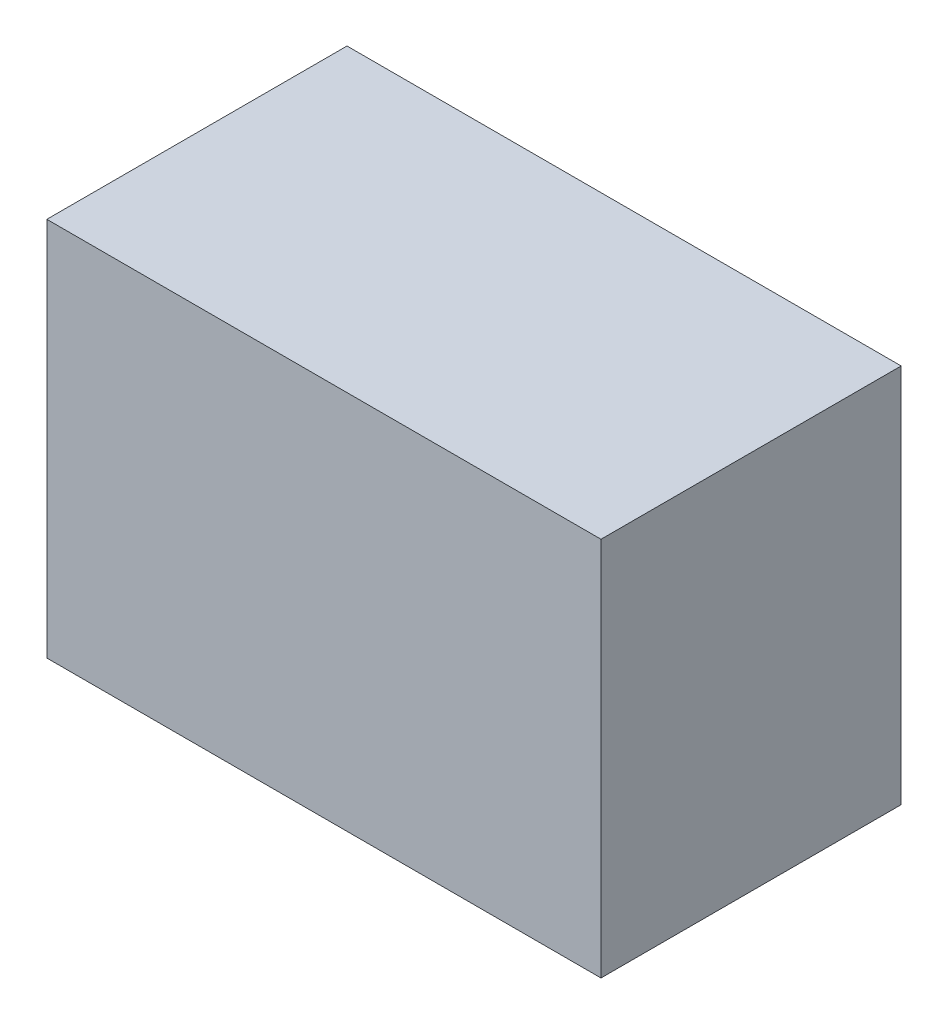
ISO-10303-21;
HEADER;
FILE_DESCRIPTION(('STEP AP214'),'2;1');
FILE_NAME('part.step','',(''),(''),'','','');
FILE_SCHEMA(('AUTOMOTIVE_DESIGN { 1 0 10303 214 1 1 1 1 }'));
ENDSEC;
DATA;
#1=APPLICATION_CONTEXT('core data for automotive mechanical design processes');
#2=APPLICATION_PROTOCOL_DEFINITION('international standard','automotive_design',2000,#1);
#3=PRODUCT_CONTEXT('',#1,'mechanical');
#4=PRODUCT('Part','Part','',(#3));
#5=PRODUCT_RELATED_PRODUCT_CATEGORY('part','',(#4));
#6=PRODUCT_DEFINITION_FORMATION('','',#4);
#7=PRODUCT_DEFINITION_CONTEXT('part definition',#1,'design');
#8=PRODUCT_DEFINITION('design','',#6,#7);
#9=PRODUCT_DEFINITION_SHAPE('','',#8);
#10=(LENGTH_UNIT() NAMED_UNIT(*) SI_UNIT(.MILLI.,.METRE.));
#11=(NAMED_UNIT(*) PLANE_ANGLE_UNIT() SI_UNIT($,.RADIAN.));
#12=(NAMED_UNIT(*) SI_UNIT($,.STERADIAN.) SOLID_ANGLE_UNIT());
#13=UNCERTAINTY_MEASURE_WITH_UNIT(LENGTH_MEASURE(1.E-05),#10,'distance_accuracy_value','');
#14=(GEOMETRIC_REPRESENTATION_CONTEXT(3) GLOBAL_UNCERTAINTY_ASSIGNED_CONTEXT((#13)) GLOBAL_UNIT_ASSIGNED_CONTEXT((#10,
#11,#12)) REPRESENTATION_CONTEXT('',''));
#15=CARTESIAN_POINT('',(0.,0.,0.));
#16=DIRECTION('',(0.,0.,1.));
#17=DIRECTION('',(1.,0.,0.));
#18=AXIS2_PLACEMENT_3D('',#15,#16,#17);
#19=CARTESIAN_POINT('',(0.,209.,0.));
#20=DIRECTION('',(1.,0.,0.));
#21=DIRECTION('',(0.,0.,-1.));
#22=AXIS2_PLACEMENT_3D('',#19,#20,#21);
#23=PLANE('',#22);
#24=DIRECTION('',(0.,0.,1.));
#25=VECTOR('',#24,1.);
#26=CARTESIAN_POINT('',(0.,0.,0.));
#27=LINE('',#26,#25);
#28=CARTESIAN_POINT('',(0.,0.,-165.1));
#29=VERTEX_POINT('',#28);
#30=CARTESIAN_POINT('',(0.,0.,0.));
#31=VERTEX_POINT('',#30);
#32=EDGE_CURVE('E97',#29,#31,#27,.T.);
#33=ORIENTED_EDGE('',*,*,#32,.T.);
#34=DIRECTION('',(0.,-1.,0.));
#35=VECTOR('',#34,1.);
#36=CARTESIAN_POINT('',(0.,209.,0.));
#37=LINE('',#36,#35);
#38=CARTESIAN_POINT('',(0.,209.,0.));
#39=VERTEX_POINT('',#38);
#40=EDGE_CURVE('E11',#39,#31,#37,.T.);
#41=ORIENTED_EDGE('',*,*,#40,.F.);
#42=DIRECTION('',(0.,0.,1.));
#43=VECTOR('',#42,1.);
#44=CARTESIAN_POINT('',(0.,209.,0.));
#45=LINE('',#44,#43);
#46=CARTESIAN_POINT('',(0.,209.,-165.1));
#47=VERTEX_POINT('',#46);
#48=EDGE_CURVE('E85',#47,#39,#45,.T.);
#49=ORIENTED_EDGE('',*,*,#48,.F.);
#50=DIRECTION('',(0.,-1.,0.));
#51=VECTOR('',#50,1.);
#52=CARTESIAN_POINT('',(0.,209.,-165.1));
#53=LINE('',#52,#51);
#54=EDGE_CURVE('E93',#47,#29,#53,.T.);
#55=ORIENTED_EDGE('',*,*,#54,.T.);
#56=EDGE_LOOP('',(#33,#41,#49,#55));
#57=FACE_BOUND('',#56,.T.);
#58=ADVANCED_FACE('F34',(#57),#23,.F.);
#59=CARTESIAN_POINT('',(0.,209.,0.));
#60=DIRECTION('',(0.,0.,-1.));
#61=DIRECTION('',(-1.,0.,0.));
#62=AXIS2_PLACEMENT_3D('',#59,#60,#61);
#63=PLANE('',#62);
#64=DIRECTION('',(1.,0.,0.));
#65=VECTOR('',#64,1.);
#66=CARTESIAN_POINT('',(0.,0.,0.));
#67=LINE('',#66,#65);
#68=CARTESIAN_POINT('',(304.8,0.,0.));
#69=VERTEX_POINT('',#68);
#70=EDGE_CURVE('E89',#31,#69,#67,.T.);
#71=ORIENTED_EDGE('',*,*,#70,.T.);
#72=DIRECTION('',(0.,-1.,0.));
#73=VECTOR('',#72,1.);
#74=CARTESIAN_POINT('',(304.8,209.,0.));
#75=LINE('',#74,#73);
#76=CARTESIAN_POINT('',(304.8,209.,0.));
#77=VERTEX_POINT('',#76);
#78=EDGE_CURVE('E42',#77,#69,#75,.T.);
#79=ORIENTED_EDGE('',*,*,#78,.F.);
#80=DIRECTION('',(1.,0.,0.));
#81=VECTOR('',#80,1.);
#82=CARTESIAN_POINT('',(0.,209.,0.));
#83=LINE('',#82,#81);
#84=EDGE_CURVE('E80',#39,#77,#83,.T.);
#85=ORIENTED_EDGE('',*,*,#84,.F.);
#86=ORIENTED_EDGE('',*,*,#40,.T.);
#87=EDGE_LOOP('',(#71,#79,#85,#86));
#88=FACE_BOUND('',#87,.T.);
#89=ADVANCED_FACE('F88',(#88),#63,.F.);
#90=CARTESIAN_POINT('',(304.8,209.,0.));
#91=DIRECTION('',(-1.,0.,0.));
#92=DIRECTION('',(0.,0.,1.));
#93=AXIS2_PLACEMENT_3D('',#90,#91,#92);
#94=PLANE('',#93);
#95=DIRECTION('',(0.,0.,-1.));
#96=VECTOR('',#95,1.);
#97=CARTESIAN_POINT('',(304.8,0.,0.));
#98=LINE('',#97,#96);
#99=CARTESIAN_POINT('',(304.8,0.,-165.1));
#100=VERTEX_POINT('',#99);
#101=EDGE_CURVE('E67',#69,#100,#98,.T.);
#102=ORIENTED_EDGE('',*,*,#101,.T.);
#103=DIRECTION('',(0.,-1.,0.));
#104=VECTOR('',#103,1.);
#105=CARTESIAN_POINT('',(304.8,209.,-165.1));
#106=LINE('',#105,#104);
#107=CARTESIAN_POINT('',(304.8,209.,-165.1));
#108=VERTEX_POINT('',#107);
#109=EDGE_CURVE('E90',#108,#100,#106,.T.);
#110=ORIENTED_EDGE('',*,*,#109,.F.);
#111=DIRECTION('',(0.,0.,-1.));
#112=VECTOR('',#111,1.);
#113=CARTESIAN_POINT('',(304.8,209.,0.));
#114=LINE('',#113,#112);
#115=EDGE_CURVE('E83',#77,#108,#114,.T.);
#116=ORIENTED_EDGE('',*,*,#115,.F.);
#117=ORIENTED_EDGE('',*,*,#78,.T.);
#118=EDGE_LOOP('',(#102,#110,#116,#117));
#119=FACE_BOUND('',#118,.T.);
#120=ADVANCED_FACE('F91',(#119),#94,.F.);
#121=CARTESIAN_POINT('',(0.,209.,-165.1));
#122=DIRECTION('',(0.,0.,1.));
#123=DIRECTION('',(1.,0.,0.));
#124=AXIS2_PLACEMENT_3D('',#121,#122,#123);
#125=PLANE('',#124);
#126=DIRECTION('',(-1.,0.,0.));
#127=VECTOR('',#126,1.);
#128=CARTESIAN_POINT('',(0.,0.,-165.1));
#129=LINE('',#128,#127);
#130=EDGE_CURVE('E73',#100,#29,#129,.T.);
#131=ORIENTED_EDGE('',*,*,#130,.T.);
#132=ORIENTED_EDGE('',*,*,#54,.F.);
#133=DIRECTION('',(-1.,0.,0.));
#134=VECTOR('',#133,1.);
#135=CARTESIAN_POINT('',(0.,209.,-165.1));
#136=LINE('',#135,#134);
#137=EDGE_CURVE('E50',#108,#47,#136,.T.);
#138=ORIENTED_EDGE('',*,*,#137,.F.);
#139=ORIENTED_EDGE('',*,*,#109,.T.);
#140=EDGE_LOOP('',(#131,#132,#138,#139));
#141=FACE_BOUND('',#140,.T.);
#142=ADVANCED_FACE('F104',(#141),#125,.F.);
#143=CARTESIAN_POINT('',(0.,209.,0.));
#144=DIRECTION('',(0.,-1.,0.));
#145=DIRECTION('',(0.,0.,-1.));
#146=AXIS2_PLACEMENT_3D('',#143,#144,#145);
#147=PLANE('',#146);
#148=ORIENTED_EDGE('',*,*,#48,.T.);
#149=ORIENTED_EDGE('',*,*,#84,.T.);
#150=ORIENTED_EDGE('',*,*,#115,.T.);
#151=ORIENTED_EDGE('',*,*,#137,.T.);
#152=EDGE_LOOP('',(#148,#149,#150,#151));
#153=FACE_BOUND('',#152,.T.);
#154=ADVANCED_FACE('F81',(#153),#147,.F.);
#155=CARTESIAN_POINT('',(0.,0.,0.));
#156=DIRECTION('',(0.,-1.,0.));
#157=DIRECTION('',(0.,0.,-1.));
#158=AXIS2_PLACEMENT_3D('',#155,#156,#157);
#159=PLANE('',#158);
#160=ORIENTED_EDGE('',*,*,#32,.F.);
#161=ORIENTED_EDGE('',*,*,#130,.F.);
#162=ORIENTED_EDGE('',*,*,#101,.F.);
#163=ORIENTED_EDGE('',*,*,#70,.F.);
#164=EDGE_LOOP('',(#160,#161,#162,#163));
#165=FACE_BOUND('',#164,.T.);
#166=ADVANCED_FACE('F107',(#165),#159,.T.);
#167=CLOSED_SHELL('',(#58,#89,#120,#142,#154,#166));
#168=MANIFOLD_SOLID_BREP('B2',#167);
#169=ADVANCED_BREP_SHAPE_REPRESENTATION('',(#18,#168),#14);
#170=SHAPE_DEFINITION_REPRESENTATION(#9,#169);
ENDSEC;
END-ISO-10303-21;
